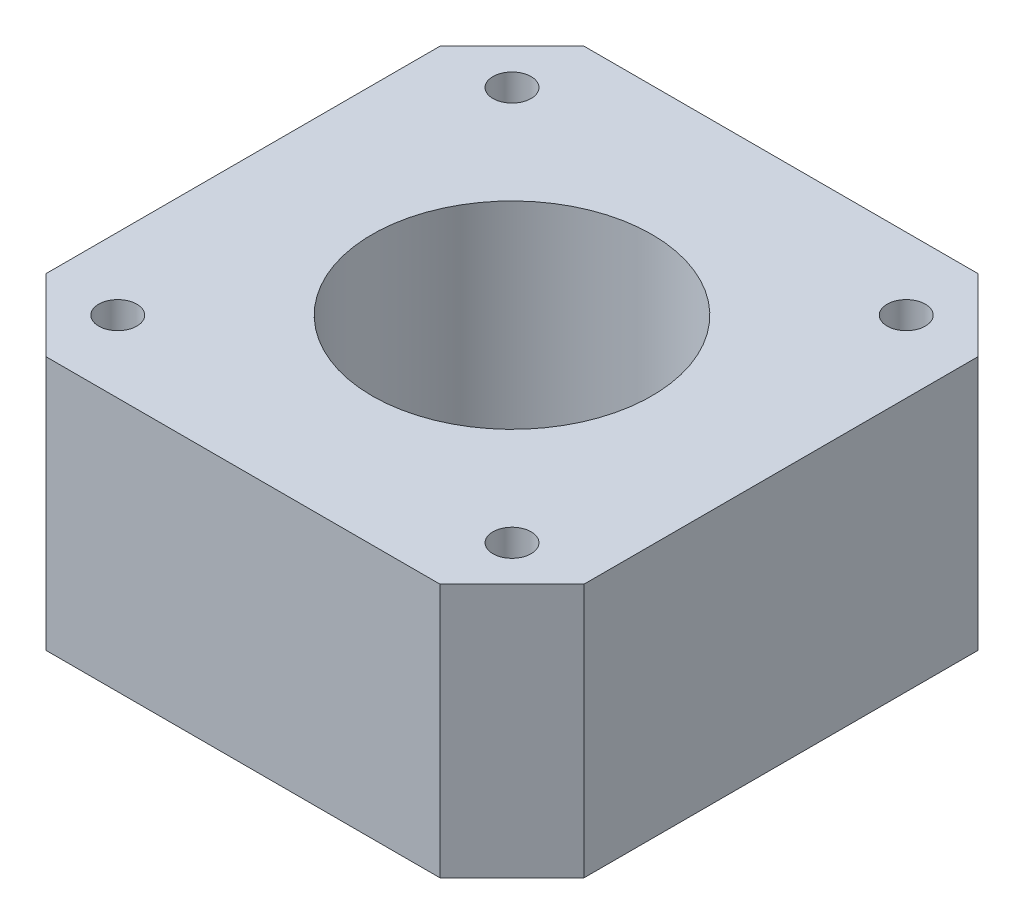
ISO-10303-21;
HEADER;
FILE_DESCRIPTION(('STEP AP214'),'2;1');
FILE_NAME('part.step','',(''),(''),'','','');
FILE_SCHEMA(('AUTOMOTIVE_DESIGN { 1 0 10303 214 1 1 1 1 }'));
ENDSEC;
DATA;
#1=APPLICATION_CONTEXT('core data for automotive mechanical design processes');
#2=APPLICATION_PROTOCOL_DEFINITION('international standard','automotive_design',2000,#1);
#3=PRODUCT_CONTEXT('',#1,'mechanical');
#4=PRODUCT('Part','Part','',(#3));
#5=PRODUCT_RELATED_PRODUCT_CATEGORY('part','',(#4));
#6=PRODUCT_DEFINITION_FORMATION('','',#4);
#7=PRODUCT_DEFINITION_CONTEXT('part definition',#1,'design');
#8=PRODUCT_DEFINITION('design','',#6,#7);
#9=PRODUCT_DEFINITION_SHAPE('','',#8);
#10=(LENGTH_UNIT() NAMED_UNIT(*) SI_UNIT(.MILLI.,.METRE.));
#11=(NAMED_UNIT(*) PLANE_ANGLE_UNIT() SI_UNIT($,.RADIAN.));
#12=(NAMED_UNIT(*) SI_UNIT($,.STERADIAN.) SOLID_ANGLE_UNIT());
#13=UNCERTAINTY_MEASURE_WITH_UNIT(LENGTH_MEASURE(1.E-05),#10,'distance_accuracy_value','');
#14=(GEOMETRIC_REPRESENTATION_CONTEXT(3) GLOBAL_UNCERTAINTY_ASSIGNED_CONTEXT((#13)) GLOBAL_UNIT_ASSIGNED_CONTEXT((#10,
#11,#12)) REPRESENTATION_CONTEXT('',''));
#15=CARTESIAN_POINT('',(0.,0.,0.));
#16=DIRECTION('',(0.,0.,1.));
#17=DIRECTION('',(1.,0.,0.));
#18=AXIS2_PLACEMENT_3D('',#15,#16,#17);
#19=CARTESIAN_POINT('',(0.,20.,21.15));
#20=DIRECTION('',(0.,0.,-1.));
#21=DIRECTION('',(-1.,0.,0.));
#22=AXIS2_PLACEMENT_3D('',#19,#20,#21);
#23=PLANE('',#22);
#24=DIRECTION('',(1.,0.,0.));
#25=VECTOR('',#24,1.);
#26=CARTESIAN_POINT('',(0.,0.,21.15));
#27=LINE('',#26,#25);
#28=CARTESIAN_POINT('',(-15.4931457505076,0.,21.15));
#29=VERTEX_POINT('',#28);
#30=CARTESIAN_POINT('',(15.4931457505076,0.,21.15));
#31=VERTEX_POINT('',#30);
#32=EDGE_CURVE('E159',#29,#31,#27,.T.);
#33=ORIENTED_EDGE('',*,*,#32,.T.);
#34=DIRECTION('',(0.,-1.,0.));
#35=VECTOR('',#34,1.);
#36=CARTESIAN_POINT('',(15.4931457505076,20.,21.15));
#37=LINE('',#36,#35);
#38=CARTESIAN_POINT('',(15.4931457505076,20.,21.15));
#39=VERTEX_POINT('',#38);
#40=EDGE_CURVE('E201',#39,#31,#37,.T.);
#41=ORIENTED_EDGE('',*,*,#40,.F.);
#42=DIRECTION('',(1.,0.,0.));
#43=VECTOR('',#42,1.);
#44=CARTESIAN_POINT('',(0.,20.,21.15));
#45=LINE('',#44,#43);
#46=CARTESIAN_POINT('',(-15.4931457505076,20.,21.15));
#47=VERTEX_POINT('',#46);
#48=EDGE_CURVE('E234',#47,#39,#45,.T.);
#49=ORIENTED_EDGE('',*,*,#48,.F.);
#50=DIRECTION('',(0.,-1.,0.));
#51=VECTOR('',#50,1.);
#52=CARTESIAN_POINT('',(-15.4931457505076,20.,21.15));
#53=LINE('',#52,#51);
#54=EDGE_CURVE('E154',#47,#29,#53,.T.);
#55=ORIENTED_EDGE('',*,*,#54,.T.);
#56=EDGE_LOOP('',(#33,#41,#49,#55));
#57=FACE_BOUND('',#56,.T.);
#58=ADVANCED_FACE('F49',(#57),#23,.F.);
#59=CARTESIAN_POINT('',(18.3215728752538,20.,18.3215728752538));
#60=DIRECTION('',(-0.707106781186548,0.,-0.707106781186547));
#61=DIRECTION('',(-0.707106781186547,0.,0.707106781186548));
#62=AXIS2_PLACEMENT_3D('',#59,#60,#61);
#63=PLANE('',#62);
#64=DIRECTION('',(0.707106781186547,0.,-0.707106781186548));
#65=VECTOR('',#64,1.);
#66=CARTESIAN_POINT('',(18.3215728752538,0.,18.3215728752538));
#67=LINE('',#66,#65);
#68=CARTESIAN_POINT('',(21.15,0.,15.4931457505076));
#69=VERTEX_POINT('',#68);
#70=EDGE_CURVE('E163',#31,#69,#67,.T.);
#71=ORIENTED_EDGE('',*,*,#70,.T.);
#72=DIRECTION('',(0.,-1.,0.));
#73=VECTOR('',#72,1.);
#74=CARTESIAN_POINT('',(21.15,20.,15.4931457505076));
#75=LINE('',#74,#73);
#76=CARTESIAN_POINT('',(21.15,20.,15.4931457505076));
#77=VERTEX_POINT('',#76);
#78=EDGE_CURVE('E198',#77,#69,#75,.T.);
#79=ORIENTED_EDGE('',*,*,#78,.F.);
#80=DIRECTION('',(0.707106781186547,0.,-0.707106781186548));
#81=VECTOR('',#80,1.);
#82=CARTESIAN_POINT('',(18.3215728752538,20.,18.3215728752538));
#83=LINE('',#82,#81);
#84=EDGE_CURVE('E110',#39,#77,#83,.T.);
#85=ORIENTED_EDGE('',*,*,#84,.F.);
#86=ORIENTED_EDGE('',*,*,#40,.T.);
#87=EDGE_LOOP('',(#71,#79,#85,#86));
#88=FACE_BOUND('',#87,.T.);
#89=ADVANCED_FACE('F278',(#88),#63,.F.);
#90=CARTESIAN_POINT('',(21.15,20.,0.));
#91=DIRECTION('',(1.,0.,0.));
#92=DIRECTION('',(0.,0.,-1.));
#93=AXIS2_PLACEMENT_3D('',#90,#91,#92);
#94=PLANE('',#93);
#95=DIRECTION('',(0.,0.,1.));
#96=VECTOR('',#95,1.);
#97=CARTESIAN_POINT('',(21.15,0.,0.));
#98=LINE('',#97,#96);
#99=CARTESIAN_POINT('',(21.15,0.,-15.4931457505076));
#100=VERTEX_POINT('',#99);
#101=EDGE_CURVE('E167',#100,#69,#98,.T.);
#102=ORIENTED_EDGE('',*,*,#101,.F.);
#103=DIRECTION('',(0.,-1.,0.));
#104=VECTOR('',#103,1.);
#105=CARTESIAN_POINT('',(21.15,20.,-15.4931457505076));
#106=LINE('',#105,#104);
#107=CARTESIAN_POINT('',(21.15,20.,-15.4931457505076));
#108=VERTEX_POINT('',#107);
#109=EDGE_CURVE('E195',#108,#100,#106,.T.);
#110=ORIENTED_EDGE('',*,*,#109,.F.);
#111=DIRECTION('',(0.,0.,1.));
#112=VECTOR('',#111,1.);
#113=CARTESIAN_POINT('',(21.15,20.,0.));
#114=LINE('',#113,#112);
#115=EDGE_CURVE('E245',#108,#77,#114,.T.);
#116=ORIENTED_EDGE('',*,*,#115,.T.);
#117=ORIENTED_EDGE('',*,*,#78,.T.);
#118=EDGE_LOOP('',(#102,#110,#116,#117));
#119=FACE_BOUND('',#118,.T.);
#120=ADVANCED_FACE('F283',(#119),#94,.T.);
#121=CARTESIAN_POINT('',(18.3215728752538,20.,-18.3215728752538));
#122=DIRECTION('',(0.707106781186548,0.,-0.707106781186547));
#123=DIRECTION('',(-0.707106781186547,0.,-0.707106781186548));
#124=AXIS2_PLACEMENT_3D('',#121,#122,#123);
#125=PLANE('',#124);
#126=DIRECTION('',(0.707106781186547,0.,0.707106781186548));
#127=VECTOR('',#126,1.);
#128=CARTESIAN_POINT('',(18.3215728752538,0.,-18.3215728752538));
#129=LINE('',#128,#127);
#130=CARTESIAN_POINT('',(15.4931457505076,0.,-21.15));
#131=VERTEX_POINT('',#130);
#132=EDGE_CURVE('E171',#131,#100,#129,.T.);
#133=ORIENTED_EDGE('',*,*,#132,.F.);
#134=DIRECTION('',(0.,-1.,0.));
#135=VECTOR('',#134,1.);
#136=CARTESIAN_POINT('',(15.4931457505076,20.,-21.15));
#137=LINE('',#136,#135);
#138=CARTESIAN_POINT('',(15.4931457505076,20.,-21.15));
#139=VERTEX_POINT('',#138);
#140=EDGE_CURVE('E192',#139,#131,#137,.T.);
#141=ORIENTED_EDGE('',*,*,#140,.F.);
#142=DIRECTION('',(0.707106781186547,0.,0.707106781186548));
#143=VECTOR('',#142,1.);
#144=CARTESIAN_POINT('',(18.3215728752538,20.,-18.3215728752538));
#145=LINE('',#144,#143);
#146=EDGE_CURVE('E148',#139,#108,#145,.T.);
#147=ORIENTED_EDGE('',*,*,#146,.T.);
#148=ORIENTED_EDGE('',*,*,#109,.T.);
#149=EDGE_LOOP('',(#133,#141,#147,#148));
#150=FACE_BOUND('',#149,.T.);
#151=ADVANCED_FACE('F252',(#150),#125,.T.);
#152=CARTESIAN_POINT('',(0.,20.,-21.15));
#153=DIRECTION('',(0.,0.,-1.));
#154=DIRECTION('',(-1.,0.,0.));
#155=AXIS2_PLACEMENT_3D('',#152,#153,#154);
#156=PLANE('',#155);
#157=DIRECTION('',(1.,0.,0.));
#158=VECTOR('',#157,1.);
#159=CARTESIAN_POINT('',(0.,0.,-21.15));
#160=LINE('',#159,#158);
#161=CARTESIAN_POINT('',(-15.4931457505076,0.,-21.15));
#162=VERTEX_POINT('',#161);
#163=EDGE_CURVE('E175',#162,#131,#160,.T.);
#164=ORIENTED_EDGE('',*,*,#163,.F.);
#165=DIRECTION('',(0.,-1.,0.));
#166=VECTOR('',#165,1.);
#167=CARTESIAN_POINT('',(-15.4931457505076,20.,-21.15));
#168=LINE('',#167,#166);
#169=CARTESIAN_POINT('',(-15.4931457505076,20.,-21.15));
#170=VERTEX_POINT('',#169);
#171=EDGE_CURVE('E133',#170,#162,#168,.T.);
#172=ORIENTED_EDGE('',*,*,#171,.F.);
#173=DIRECTION('',(1.,0.,0.));
#174=VECTOR('',#173,1.);
#175=CARTESIAN_POINT('',(0.,20.,-21.15));
#176=LINE('',#175,#174);
#177=EDGE_CURVE('E144',#170,#139,#176,.T.);
#178=ORIENTED_EDGE('',*,*,#177,.T.);
#179=ORIENTED_EDGE('',*,*,#140,.T.);
#180=EDGE_LOOP('',(#164,#172,#178,#179));
#181=FACE_BOUND('',#180,.T.);
#182=ADVANCED_FACE('F257',(#181),#156,.T.);
#183=CARTESIAN_POINT('',(-18.3215728752538,20.,-18.3215728752538));
#184=DIRECTION('',(-0.707106781186548,0.,-0.707106781186547));
#185=DIRECTION('',(-0.707106781186547,0.,0.707106781186548));
#186=AXIS2_PLACEMENT_3D('',#183,#184,#185);
#187=PLANE('',#186);
#188=DIRECTION('',(0.707106781186547,0.,-0.707106781186548));
#189=VECTOR('',#188,1.);
#190=CARTESIAN_POINT('',(-18.3215728752538,0.,-18.3215728752538));
#191=LINE('',#190,#189);
#192=CARTESIAN_POINT('',(-21.15,0.,-15.4931457505076));
#193=VERTEX_POINT('',#192);
#194=EDGE_CURVE('E131',#193,#162,#191,.T.);
#195=ORIENTED_EDGE('',*,*,#194,.F.);
#196=DIRECTION('',(0.,-1.,0.));
#197=VECTOR('',#196,1.);
#198=CARTESIAN_POINT('',(-21.15,20.,-15.4931457505076));
#199=LINE('',#198,#197);
#200=CARTESIAN_POINT('',(-21.15,20.,-15.4931457505076));
#201=VERTEX_POINT('',#200);
#202=EDGE_CURVE('E125',#201,#193,#199,.T.);
#203=ORIENTED_EDGE('',*,*,#202,.F.);
#204=DIRECTION('',(0.707106781186547,0.,-0.707106781186548));
#205=VECTOR('',#204,1.);
#206=CARTESIAN_POINT('',(-18.3215728752538,20.,-18.3215728752538));
#207=LINE('',#206,#205);
#208=EDGE_CURVE('E129',#201,#170,#207,.T.);
#209=ORIENTED_EDGE('',*,*,#208,.T.);
#210=ORIENTED_EDGE('',*,*,#171,.T.);
#211=EDGE_LOOP('',(#195,#203,#209,#210));
#212=FACE_BOUND('',#211,.T.);
#213=ADVANCED_FACE('F127',(#212),#187,.T.);
#214=CARTESIAN_POINT('',(-21.15,20.,0.));
#215=DIRECTION('',(1.,0.,0.));
#216=DIRECTION('',(0.,0.,-1.));
#217=AXIS2_PLACEMENT_3D('',#214,#215,#216);
#218=PLANE('',#217);
#219=DIRECTION('',(0.,0.,1.));
#220=VECTOR('',#219,1.);
#221=CARTESIAN_POINT('',(-21.15,0.,0.));
#222=LINE('',#221,#220);
#223=CARTESIAN_POINT('',(-21.15,0.,15.4931457505076));
#224=VERTEX_POINT('',#223);
#225=EDGE_CURVE('E95',#193,#224,#222,.T.);
#226=ORIENTED_EDGE('',*,*,#225,.T.);
#227=DIRECTION('',(0.,-1.,0.));
#228=VECTOR('',#227,1.);
#229=CARTESIAN_POINT('',(-21.15,20.,15.4931457505076));
#230=LINE('',#229,#228);
#231=CARTESIAN_POINT('',(-21.15,20.,15.4931457505076));
#232=VERTEX_POINT('',#231);
#233=EDGE_CURVE('E134',#232,#224,#230,.T.);
#234=ORIENTED_EDGE('',*,*,#233,.F.);
#235=DIRECTION('',(0.,0.,1.));
#236=VECTOR('',#235,1.);
#237=CARTESIAN_POINT('',(-21.15,20.,0.));
#238=LINE('',#237,#236);
#239=EDGE_CURVE('E136',#201,#232,#238,.T.);
#240=ORIENTED_EDGE('',*,*,#239,.F.);
#241=ORIENTED_EDGE('',*,*,#202,.T.);
#242=EDGE_LOOP('',(#226,#234,#240,#241));
#243=FACE_BOUND('',#242,.T.);
#244=ADVANCED_FACE('F137',(#243),#218,.F.);
#245=CARTESIAN_POINT('',(-15.5,20.,-15.5));
#246=DIRECTION('',(0.,-1.,0.));
#247=DIRECTION('',(0.,0.,-1.));
#248=AXIS2_PLACEMENT_3D('',#245,#246,#247);
#249=CYLINDRICAL_SURFACE('',#248,1.5);
#250=CARTESIAN_POINT('',(-15.5,17.5,-15.5));
#251=DIRECTION('',(0.,1.,0.));
#252=DIRECTION('',(0.,0.,1.));
#253=AXIS2_PLACEMENT_3D('',#250,#251,#252);
#254=CIRCLE('',#253,1.5);
#255=CARTESIAN_POINT('',(-15.5,17.5,-14.));
#256=VERTEX_POINT('',#255);
#257=EDGE_CURVE('E12',#256,#256,#254,.T.);
#258=ORIENTED_EDGE('',*,*,#257,.F.);
#259=EDGE_LOOP('',(#258));
#260=FACE_BOUND('',#259,.T.);
#261=CARTESIAN_POINT('',(-15.5,20.,-15.5));
#262=DIRECTION('',(0.,1.,0.));
#263=DIRECTION('',(0.,0.,1.));
#264=AXIS2_PLACEMENT_3D('',#261,#262,#263);
#265=CIRCLE('',#264,1.5);
#266=CARTESIAN_POINT('',(-15.5,20.,-14.));
#267=VERTEX_POINT('',#266);
#268=EDGE_CURVE('E228',#267,#267,#265,.T.);
#269=ORIENTED_EDGE('',*,*,#268,.T.);
#270=EDGE_LOOP('',(#269));
#271=FACE_BOUND('',#270,.T.);
#272=ADVANCED_FACE('F221',(#260,#271),#249,.F.);
#273=CARTESIAN_POINT('',(15.5,20.,-15.5));
#274=DIRECTION('',(0.,-1.,0.));
#275=DIRECTION('',(0.,0.,-1.));
#276=AXIS2_PLACEMENT_3D('',#273,#274,#275);
#277=CYLINDRICAL_SURFACE('',#276,1.5);
#278=CARTESIAN_POINT('',(15.5,17.5,-15.5));
#279=DIRECTION('',(0.,1.,0.));
#280=DIRECTION('',(0.,0.,1.));
#281=AXIS2_PLACEMENT_3D('',#278,#279,#280);
#282=CIRCLE('',#281,1.5);
#283=CARTESIAN_POINT('',(15.5,17.5,-14.));
#284=VERTEX_POINT('',#283);
#285=EDGE_CURVE('E59',#284,#284,#282,.T.);
#286=ORIENTED_EDGE('',*,*,#285,.F.);
#287=EDGE_LOOP('',(#286));
#288=FACE_BOUND('',#287,.T.);
#289=CARTESIAN_POINT('',(15.5,20.,-15.5));
#290=DIRECTION('',(0.,1.,0.));
#291=DIRECTION('',(0.,0.,1.));
#292=AXIS2_PLACEMENT_3D('',#289,#290,#291);
#293=CIRCLE('',#292,1.5);
#294=CARTESIAN_POINT('',(15.5,20.,-14.));
#295=VERTEX_POINT('',#294);
#296=EDGE_CURVE('E225',#295,#295,#293,.T.);
#297=ORIENTED_EDGE('',*,*,#296,.T.);
#298=EDGE_LOOP('',(#297));
#299=FACE_BOUND('',#298,.T.);
#300=ADVANCED_FACE('F217',(#288,#299),#277,.F.);
#301=CARTESIAN_POINT('',(15.5,20.,15.5));
#302=DIRECTION('',(0.,-1.,0.));
#303=DIRECTION('',(0.,0.,-1.));
#304=AXIS2_PLACEMENT_3D('',#301,#302,#303);
#305=CYLINDRICAL_SURFACE('',#304,1.5);
#306=CARTESIAN_POINT('',(15.5,17.5,15.5));
#307=DIRECTION('',(0.,1.,0.));
#308=DIRECTION('',(0.,0.,1.));
#309=AXIS2_PLACEMENT_3D('',#306,#307,#308);
#310=CIRCLE('',#309,1.5);
#311=CARTESIAN_POINT('',(15.5,17.5,17.));
#312=VERTEX_POINT('',#311);
#313=EDGE_CURVE('E204',#312,#312,#310,.T.);
#314=ORIENTED_EDGE('',*,*,#313,.F.);
#315=EDGE_LOOP('',(#314));
#316=FACE_BOUND('',#315,.T.);
#317=CARTESIAN_POINT('',(15.5,20.,15.5));
#318=DIRECTION('',(0.,1.,0.));
#319=DIRECTION('',(0.,0.,1.));
#320=AXIS2_PLACEMENT_3D('',#317,#318,#319);
#321=CIRCLE('',#320,1.5);
#322=CARTESIAN_POINT('',(15.5,20.,17.));
#323=VERTEX_POINT('',#322);
#324=EDGE_CURVE('E229',#323,#323,#321,.T.);
#325=ORIENTED_EDGE('',*,*,#324,.T.);
#326=EDGE_LOOP('',(#325));
#327=FACE_BOUND('',#326,.T.);
#328=ADVANCED_FACE('F220',(#316,#327),#305,.F.);
#329=CARTESIAN_POINT('',(-15.5,20.,15.5));
#330=DIRECTION('',(0.,-1.,0.));
#331=DIRECTION('',(0.,0.,-1.));
#332=AXIS2_PLACEMENT_3D('',#329,#330,#331);
#333=CYLINDRICAL_SURFACE('',#332,1.5);
#334=CARTESIAN_POINT('',(-15.5,17.5,15.5));
#335=DIRECTION('',(0.,1.,0.));
#336=DIRECTION('',(0.,0.,1.));
#337=AXIS2_PLACEMENT_3D('',#334,#335,#336);
#338=CIRCLE('',#337,1.5);
#339=CARTESIAN_POINT('',(-15.5,17.5,17.));
#340=VERTEX_POINT('',#339);
#341=EDGE_CURVE('E208',#340,#340,#338,.T.);
#342=ORIENTED_EDGE('',*,*,#341,.F.);
#343=EDGE_LOOP('',(#342));
#344=FACE_BOUND('',#343,.T.);
#345=CARTESIAN_POINT('',(-15.5,20.,15.5));
#346=DIRECTION('',(0.,1.,0.));
#347=DIRECTION('',(0.,0.,1.));
#348=AXIS2_PLACEMENT_3D('',#345,#346,#347);
#349=CIRCLE('',#348,1.5);
#350=CARTESIAN_POINT('',(-15.5,20.,17.));
#351=VERTEX_POINT('',#350);
#352=EDGE_CURVE('E237',#351,#351,#349,.T.);
#353=ORIENTED_EDGE('',*,*,#352,.T.);
#354=EDGE_LOOP('',(#353));
#355=FACE_BOUND('',#354,.T.);
#356=ADVANCED_FACE('F273',(#344,#355),#333,.F.);
#357=CARTESIAN_POINT('',(0.,20.,0.));
#358=DIRECTION('',(0.,-1.,0.));
#359=DIRECTION('',(0.,0.,-1.));
#360=AXIS2_PLACEMENT_3D('',#357,#358,#359);
#361=CYLINDRICAL_SURFACE('',#360,11.);
#362=CARTESIAN_POINT('',(0.,20.,0.));
#363=DIRECTION('',(0.,1.,0.));
#364=DIRECTION('',(0.,0.,1.));
#365=AXIS2_PLACEMENT_3D('',#362,#363,#364);
#366=CIRCLE('',#365,11.);
#367=CARTESIAN_POINT('',(0.,20.,11.));
#368=VERTEX_POINT('',#367);
#369=EDGE_CURVE('E185',#368,#368,#366,.T.);
#370=ORIENTED_EDGE('',*,*,#369,.T.);
#371=EDGE_LOOP('',(#370));
#372=FACE_BOUND('',#371,.T.);
#373=CARTESIAN_POINT('',(0.,0.,0.));
#374=DIRECTION('',(0.,1.,0.));
#375=DIRECTION('',(0.,0.,1.));
#376=AXIS2_PLACEMENT_3D('',#373,#374,#375);
#377=CIRCLE('',#376,11.);
#378=CARTESIAN_POINT('',(0.,0.,11.));
#379=VERTEX_POINT('',#378);
#380=EDGE_CURVE('E155',#379,#379,#377,.T.);
#381=ORIENTED_EDGE('',*,*,#380,.F.);
#382=EDGE_LOOP('',(#381));
#383=FACE_BOUND('',#382,.T.);
#384=ADVANCED_FACE('F51',(#372,#383),#361,.F.);
#385=CARTESIAN_POINT('',(-18.3215728752538,20.,18.3215728752538));
#386=DIRECTION('',(0.707106781186548,0.,-0.707106781186548));
#387=DIRECTION('',(-0.707106781186548,0.,-0.707106781186548));
#388=AXIS2_PLACEMENT_3D('',#385,#386,#387);
#389=PLANE('',#388);
#390=DIRECTION('',(0.707106781186548,0.,0.707106781186548));
#391=VECTOR('',#390,1.);
#392=CARTESIAN_POINT('',(-18.3215728752538,0.,18.3215728752538));
#393=LINE('',#392,#391);
#394=EDGE_CURVE('E101',#224,#29,#393,.T.);
#395=ORIENTED_EDGE('',*,*,#394,.T.);
#396=ORIENTED_EDGE('',*,*,#54,.F.);
#397=DIRECTION('',(0.707106781186548,0.,0.707106781186548));
#398=VECTOR('',#397,1.);
#399=CARTESIAN_POINT('',(-18.3215728752538,20.,18.3215728752538));
#400=LINE('',#399,#398);
#401=EDGE_CURVE('E67',#232,#47,#400,.T.);
#402=ORIENTED_EDGE('',*,*,#401,.F.);
#403=ORIENTED_EDGE('',*,*,#233,.T.);
#404=EDGE_LOOP('',(#395,#396,#402,#403));
#405=FACE_BOUND('',#404,.T.);
#406=ADVANCED_FACE('F264',(#405),#389,.F.);
#407=CARTESIAN_POINT('',(0.,20.,0.));
#408=DIRECTION('',(0.,1.,0.));
#409=DIRECTION('',(0.,0.,1.));
#410=AXIS2_PLACEMENT_3D('',#407,#408,#409);
#411=PLANE('',#410);
#412=ORIENTED_EDGE('',*,*,#369,.F.);
#413=EDGE_LOOP('',(#412));
#414=FACE_BOUND('',#413,.T.);
#415=ORIENTED_EDGE('',*,*,#352,.F.);
#416=EDGE_LOOP('',(#415));
#417=FACE_BOUND('',#416,.T.);
#418=ORIENTED_EDGE('',*,*,#324,.F.);
#419=EDGE_LOOP('',(#418));
#420=FACE_BOUND('',#419,.T.);
#421=ORIENTED_EDGE('',*,*,#296,.F.);
#422=EDGE_LOOP('',(#421));
#423=FACE_BOUND('',#422,.T.);
#424=ORIENTED_EDGE('',*,*,#268,.F.);
#425=EDGE_LOOP('',(#424));
#426=FACE_BOUND('',#425,.T.);
#427=ORIENTED_EDGE('',*,*,#48,.T.);
#428=ORIENTED_EDGE('',*,*,#84,.T.);
#429=ORIENTED_EDGE('',*,*,#115,.F.);
#430=ORIENTED_EDGE('',*,*,#146,.F.);
#431=ORIENTED_EDGE('',*,*,#177,.F.);
#432=ORIENTED_EDGE('',*,*,#208,.F.);
#433=ORIENTED_EDGE('',*,*,#239,.T.);
#434=ORIENTED_EDGE('',*,*,#401,.T.);
#435=EDGE_LOOP('',(#427,#428,#429,#430,#431,#432,#433,#434));
#436=FACE_BOUND('',#435,.T.);
#437=ADVANCED_FACE('F141',(#414,#417,#420,#423,#426,#436),#411,.T.);
#438=CARTESIAN_POINT('',(0.,0.,0.));
#439=DIRECTION('',(0.,1.,0.));
#440=DIRECTION('',(0.,0.,1.));
#441=AXIS2_PLACEMENT_3D('',#438,#439,#440);
#442=PLANE('',#441);
#443=ORIENTED_EDGE('',*,*,#380,.T.);
#444=EDGE_LOOP('',(#443));
#445=FACE_BOUND('',#444,.T.);
#446=ORIENTED_EDGE('',*,*,#32,.F.);
#447=ORIENTED_EDGE('',*,*,#394,.F.);
#448=ORIENTED_EDGE('',*,*,#225,.F.);
#449=ORIENTED_EDGE('',*,*,#194,.T.);
#450=ORIENTED_EDGE('',*,*,#163,.T.);
#451=ORIENTED_EDGE('',*,*,#132,.T.);
#452=ORIENTED_EDGE('',*,*,#101,.T.);
#453=ORIENTED_EDGE('',*,*,#70,.F.);
#454=EDGE_LOOP('',(#446,#447,#448,#449,#450,#451,#452,#453));
#455=FACE_BOUND('',#454,.T.);
#456=ADVANCED_FACE('F260',(#445,#455),#442,.F.);
#457=CARTESIAN_POINT('',(0.,17.5,0.));
#458=DIRECTION('',(0.,1.,0.));
#459=DIRECTION('',(0.,0.,1.));
#460=AXIS2_PLACEMENT_3D('',#457,#458,#459);
#461=PLANE('',#460);
#462=ORIENTED_EDGE('',*,*,#313,.T.);
#463=EDGE_LOOP('',(#462));
#464=FACE_BOUND('',#463,.T.);
#465=ADVANCED_FACE('F316',(#464),#461,.T.);
#466=CARTESIAN_POINT('',(0.,17.5,0.));
#467=DIRECTION('',(0.,1.,0.));
#468=DIRECTION('',(0.,0.,1.));
#469=AXIS2_PLACEMENT_3D('',#466,#467,#468);
#470=PLANE('',#469);
#471=ORIENTED_EDGE('',*,*,#341,.T.);
#472=EDGE_LOOP('',(#471));
#473=FACE_BOUND('',#472,.T.);
#474=ADVANCED_FACE('F320',(#473),#470,.T.);
#475=CARTESIAN_POINT('',(0.,17.5,0.));
#476=DIRECTION('',(0.,1.,0.));
#477=DIRECTION('',(0.,0.,1.));
#478=AXIS2_PLACEMENT_3D('',#475,#476,#477);
#479=PLANE('',#478);
#480=ORIENTED_EDGE('',*,*,#285,.T.);
#481=EDGE_LOOP('',(#480));
#482=FACE_BOUND('',#481,.T.);
#483=ADVANCED_FACE('F215',(#482),#479,.T.);
#484=CARTESIAN_POINT('',(0.,17.5,0.));
#485=DIRECTION('',(0.,1.,0.));
#486=DIRECTION('',(0.,0.,1.));
#487=AXIS2_PLACEMENT_3D('',#484,#485,#486);
#488=PLANE('',#487);
#489=ORIENTED_EDGE('',*,*,#257,.T.);
#490=EDGE_LOOP('',(#489));
#491=FACE_BOUND('',#490,.T.);
#492=ADVANCED_FACE('F329',(#491),#488,.T.);
#493=CLOSED_SHELL('',(#58,#89,#120,#151,#182,#213,#244,#272,#300,#328,#356,#384,#406,#437,#456,
#465,#474,#483,#492));
#494=MANIFOLD_SOLID_BREP('B2',#493);
#495=ADVANCED_BREP_SHAPE_REPRESENTATION('',(#18,#494),#14);
#496=SHAPE_DEFINITION_REPRESENTATION(#9,#495);
ENDSEC;
END-ISO-10303-21;
